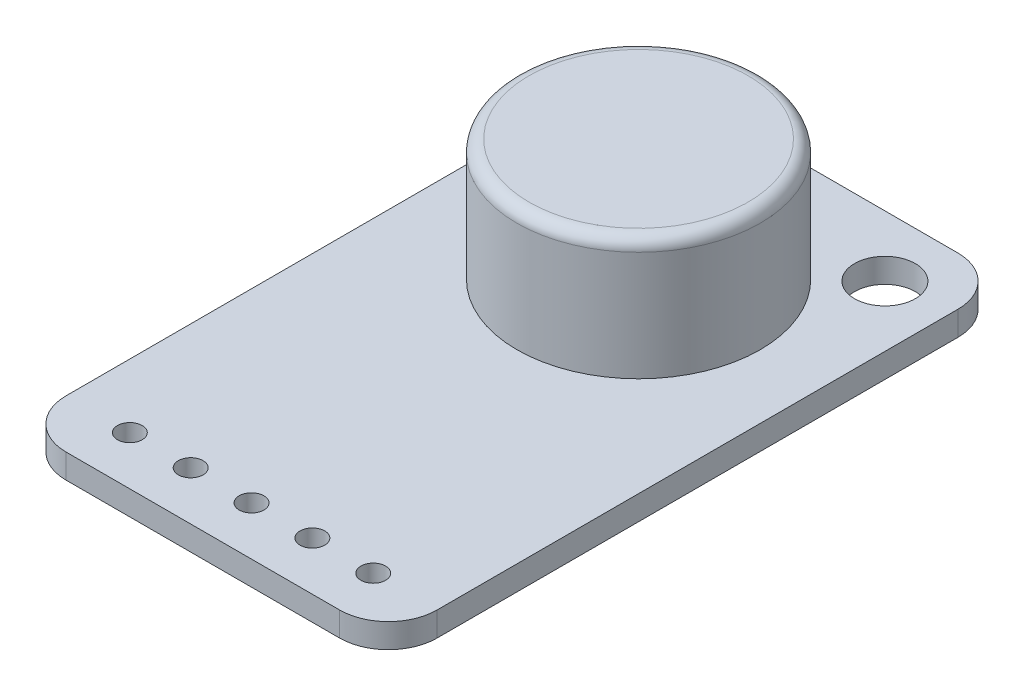
ISO-10303-21;
HEADER;
FILE_DESCRIPTION(('STEP AP214'),'2;1');
FILE_NAME('part.step','',(''),(''),'','','');
FILE_SCHEMA(('AUTOMOTIVE_DESIGN { 1 0 10303 214 1 1 1 1 }'));
ENDSEC;
DATA;
#1=APPLICATION_CONTEXT('core data for automotive mechanical design processes');
#2=APPLICATION_PROTOCOL_DEFINITION('international standard','automotive_design',2000,#1);
#3=PRODUCT_CONTEXT('',#1,'mechanical');
#4=PRODUCT('Part','Part','',(#3));
#5=PRODUCT_RELATED_PRODUCT_CATEGORY('part','',(#4));
#6=PRODUCT_DEFINITION_FORMATION('','',#4);
#7=PRODUCT_DEFINITION_CONTEXT('part definition',#1,'design');
#8=PRODUCT_DEFINITION('design','',#6,#7);
#9=PRODUCT_DEFINITION_SHAPE('','',#8);
#10=(LENGTH_UNIT() NAMED_UNIT(*) SI_UNIT(.MILLI.,.METRE.));
#11=(NAMED_UNIT(*) PLANE_ANGLE_UNIT() SI_UNIT($,.RADIAN.));
#12=(NAMED_UNIT(*) SI_UNIT($,.STERADIAN.) SOLID_ANGLE_UNIT());
#13=UNCERTAINTY_MEASURE_WITH_UNIT(LENGTH_MEASURE(1.E-05),#10,'distance_accuracy_value','');
#14=(GEOMETRIC_REPRESENTATION_CONTEXT(3) GLOBAL_UNCERTAINTY_ASSIGNED_CONTEXT((#13)) GLOBAL_UNIT_ASSIGNED_CONTEXT((#10,
#11,#12)) REPRESENTATION_CONTEXT('',''));
#15=CARTESIAN_POINT('',(0.,0.,0.));
#16=DIRECTION('',(0.,0.,1.));
#17=DIRECTION('',(1.,0.,0.));
#18=AXIS2_PLACEMENT_3D('',#15,#16,#17);
#19=CARTESIAN_POINT('',(0.,1.,0.));
#20=DIRECTION('',(-1.,0.,0.));
#21=DIRECTION('',(0.,0.,1.));
#22=AXIS2_PLACEMENT_3D('',#19,#20,#21);
#23=PLANE('',#22);
#24=DIRECTION('',(0.,0.,-1.));
#25=VECTOR('',#24,1.);
#26=CARTESIAN_POINT('',(0.,1.,0.));
#27=LINE('',#26,#25);
#28=CARTESIAN_POINT('',(0.,1.,-2.));
#29=VERTEX_POINT('',#28);
#30=CARTESIAN_POINT('',(0.,1.,-23.4));
#31=VERTEX_POINT('',#30);
#32=EDGE_CURVE('E129',#29,#31,#27,.T.);
#33=ORIENTED_EDGE('',*,*,#32,.F.);
#34=DIRECTION('',(0.,-1.,0.));
#35=VECTOR('',#34,1.);
#36=CARTESIAN_POINT('',(0.,1.,-2.));
#37=LINE('',#36,#35);
#38=CARTESIAN_POINT('',(0.,0.,-2.));
#39=VERTEX_POINT('',#38);
#40=EDGE_CURVE('E155',#29,#39,#37,.T.);
#41=ORIENTED_EDGE('',*,*,#40,.T.);
#42=DIRECTION('',(0.,0.,-1.));
#43=VECTOR('',#42,1.);
#44=CARTESIAN_POINT('',(0.,0.,0.));
#45=LINE('',#44,#43);
#46=CARTESIAN_POINT('',(0.,0.,-23.4));
#47=VERTEX_POINT('',#46);
#48=EDGE_CURVE('E209',#39,#47,#45,.T.);
#49=ORIENTED_EDGE('',*,*,#48,.T.);
#50=DIRECTION('',(0.,-1.,0.));
#51=VECTOR('',#50,1.);
#52=CARTESIAN_POINT('',(0.,1.,-23.4));
#53=LINE('',#52,#51);
#54=EDGE_CURVE('E153',#47,#31,#53,.F.);
#55=ORIENTED_EDGE('',*,*,#54,.T.);
#56=EDGE_LOOP('',(#33,#41,#49,#55));
#57=FACE_BOUND('',#56,.T.);
#58=ADVANCED_FACE('F36',(#57),#23,.F.);
#59=CARTESIAN_POINT('',(0.,1.,-25.4));
#60=DIRECTION('',(0.,0.,1.));
#61=DIRECTION('',(1.,0.,0.));
#62=AXIS2_PLACEMENT_3D('',#59,#60,#61);
#63=PLANE('',#62);
#64=DIRECTION('',(-1.,0.,0.));
#65=VECTOR('',#64,1.);
#66=CARTESIAN_POINT('',(0.,0.,-25.4));
#67=LINE('',#66,#65);
#68=CARTESIAN_POINT('',(-2.,0.,-25.4));
#69=VERTEX_POINT('',#68);
#70=CARTESIAN_POINT('',(-13.24,0.,-25.4));
#71=VERTEX_POINT('',#70);
#72=EDGE_CURVE('E134',#69,#71,#67,.T.);
#73=ORIENTED_EDGE('',*,*,#72,.T.);
#74=DIRECTION('',(0.,-1.,0.));
#75=VECTOR('',#74,1.);
#76=CARTESIAN_POINT('',(-13.24,1.,-25.4));
#77=LINE('',#76,#75);
#78=CARTESIAN_POINT('',(-13.24,1.,-25.4));
#79=VERTEX_POINT('',#78);
#80=EDGE_CURVE('E51',#71,#79,#77,.F.);
#81=ORIENTED_EDGE('',*,*,#80,.T.);
#82=DIRECTION('',(-1.,0.,0.));
#83=VECTOR('',#82,1.);
#84=CARTESIAN_POINT('',(0.,1.,-25.4));
#85=LINE('',#84,#83);
#86=CARTESIAN_POINT('',(-2.,1.,-25.4));
#87=VERTEX_POINT('',#86);
#88=EDGE_CURVE('E132',#87,#79,#85,.T.);
#89=ORIENTED_EDGE('',*,*,#88,.F.);
#90=DIRECTION('',(0.,-1.,0.));
#91=VECTOR('',#90,1.);
#92=CARTESIAN_POINT('',(-2.,1.,-25.4));
#93=LINE('',#92,#91);
#94=EDGE_CURVE('E158',#87,#69,#93,.T.);
#95=ORIENTED_EDGE('',*,*,#94,.T.);
#96=EDGE_LOOP('',(#73,#81,#89,#95));
#97=FACE_BOUND('',#96,.T.);
#98=ADVANCED_FACE('F175',(#97),#63,.F.);
#99=CARTESIAN_POINT('',(-15.24,1.,0.));
#100=DIRECTION('',(1.,0.,0.));
#101=DIRECTION('',(0.,0.,-1.));
#102=AXIS2_PLACEMENT_3D('',#99,#100,#101);
#103=PLANE('',#102);
#104=DIRECTION('',(0.,0.,1.));
#105=VECTOR('',#104,1.);
#106=CARTESIAN_POINT('',(-15.24,0.,0.));
#107=LINE('',#106,#105);
#108=CARTESIAN_POINT('',(-15.24,0.,-23.4));
#109=VERTEX_POINT('',#108);
#110=CARTESIAN_POINT('',(-15.24,0.,-2.));
#111=VERTEX_POINT('',#110);
#112=EDGE_CURVE('E130',#109,#111,#107,.T.);
#113=ORIENTED_EDGE('',*,*,#112,.T.);
#114=DIRECTION('',(0.,-1.,0.));
#115=VECTOR('',#114,1.);
#116=CARTESIAN_POINT('',(-15.24,1.,-2.));
#117=LINE('',#116,#115);
#118=CARTESIAN_POINT('',(-15.24,1.,-2.));
#119=VERTEX_POINT('',#118);
#120=EDGE_CURVE('E108',#111,#119,#117,.F.);
#121=ORIENTED_EDGE('',*,*,#120,.T.);
#122=DIRECTION('',(0.,0.,1.));
#123=VECTOR('',#122,1.);
#124=CARTESIAN_POINT('',(-15.24,1.,0.));
#125=LINE('',#124,#123);
#126=CARTESIAN_POINT('',(-15.24,1.,-23.4));
#127=VERTEX_POINT('',#126);
#128=EDGE_CURVE('E214',#127,#119,#125,.T.);
#129=ORIENTED_EDGE('',*,*,#128,.F.);
#130=DIRECTION('',(0.,-1.,0.));
#131=VECTOR('',#130,1.);
#132=CARTESIAN_POINT('',(-15.24,1.,-23.4));
#133=LINE('',#132,#131);
#134=EDGE_CURVE('E113',#127,#109,#133,.T.);
#135=ORIENTED_EDGE('',*,*,#134,.T.);
#136=EDGE_LOOP('',(#113,#121,#129,#135));
#137=FACE_BOUND('',#136,.T.);
#138=ADVANCED_FACE('F181',(#137),#103,.F.);
#139=CARTESIAN_POINT('',(0.,1.,0.));
#140=DIRECTION('',(0.,0.,-1.));
#141=DIRECTION('',(-1.,0.,0.));
#142=AXIS2_PLACEMENT_3D('',#139,#140,#141);
#143=PLANE('',#142);
#144=DIRECTION('',(1.,0.,0.));
#145=VECTOR('',#144,1.);
#146=CARTESIAN_POINT('',(0.,1.,0.));
#147=LINE('',#146,#145);
#148=CARTESIAN_POINT('',(-13.24,1.,0.));
#149=VERTEX_POINT('',#148);
#150=CARTESIAN_POINT('',(-2.,1.,0.));
#151=VERTEX_POINT('',#150);
#152=EDGE_CURVE('E123',#149,#151,#147,.T.);
#153=ORIENTED_EDGE('',*,*,#152,.F.);
#154=DIRECTION('',(0.,-1.,0.));
#155=VECTOR('',#154,1.);
#156=CARTESIAN_POINT('',(-13.24,1.,0.));
#157=LINE('',#156,#155);
#158=CARTESIAN_POINT('',(-13.24,0.,0.));
#159=VERTEX_POINT('',#158);
#160=EDGE_CURVE('E107',#149,#159,#157,.T.);
#161=ORIENTED_EDGE('',*,*,#160,.T.);
#162=DIRECTION('',(1.,0.,0.));
#163=VECTOR('',#162,1.);
#164=CARTESIAN_POINT('',(0.,0.,0.));
#165=LINE('',#164,#163);
#166=CARTESIAN_POINT('',(-2.,0.,0.));
#167=VERTEX_POINT('',#166);
#168=EDGE_CURVE('E120',#159,#167,#165,.T.);
#169=ORIENTED_EDGE('',*,*,#168,.T.);
#170=DIRECTION('',(0.,-1.,0.));
#171=VECTOR('',#170,1.);
#172=CARTESIAN_POINT('',(-2.,1.,0.));
#173=LINE('',#172,#171);
#174=EDGE_CURVE('E125',#167,#151,#173,.F.);
#175=ORIENTED_EDGE('',*,*,#174,.T.);
#176=EDGE_LOOP('',(#153,#161,#169,#175));
#177=FACE_BOUND('',#176,.T.);
#178=ADVANCED_FACE('F119',(#177),#143,.F.);
#179=CARTESIAN_POINT('',(0.,1.,0.));
#180=DIRECTION('',(0.,1.,0.));
#181=DIRECTION('',(0.,0.,1.));
#182=AXIS2_PLACEMENT_3D('',#179,#180,#181);
#183=PLANE('',#182);
#184=CARTESIAN_POINT('',(-7.62,1.,-17.9));
#185=DIRECTION('',(0.,1.,0.));
#186=DIRECTION('',(0.,0.,1.));
#187=AXIS2_PLACEMENT_3D('',#184,#185,#186);
#188=CIRCLE('',#187,5.);
#189=CARTESIAN_POINT('',(-7.62,1.,-12.9));
#190=VERTEX_POINT('',#189);
#191=EDGE_CURVE('E228',#190,#190,#188,.T.);
#192=ORIENTED_EDGE('',*,*,#191,.F.);
#193=EDGE_LOOP('',(#192));
#194=FACE_BOUND('',#193,.T.);
#195=CARTESIAN_POINT('',(-12.74,1.,-22.9));
#196=DIRECTION('',(0.,1.,0.));
#197=DIRECTION('',(0.,0.,1.));
#198=AXIS2_PLACEMENT_3D('',#195,#196,#197);
#199=CIRCLE('',#198,1.25);
#200=CARTESIAN_POINT('',(-12.74,1.,-21.65));
#201=VERTEX_POINT('',#200);
#202=EDGE_CURVE('E255',#201,#201,#199,.T.);
#203=ORIENTED_EDGE('',*,*,#202,.F.);
#204=EDGE_LOOP('',(#203));
#205=FACE_BOUND('',#204,.T.);
#206=CARTESIAN_POINT('',(-12.62,1.,-2.));
#207=DIRECTION('',(0.,1.,0.));
#208=DIRECTION('',(0.,0.,1.));
#209=AXIS2_PLACEMENT_3D('',#206,#207,#208);
#210=CIRCLE('',#209,0.508);
#211=CARTESIAN_POINT('',(-12.62,1.,-1.492));
#212=VERTEX_POINT('',#211);
#213=EDGE_CURVE('E249',#212,#212,#210,.T.);
#214=ORIENTED_EDGE('',*,*,#213,.F.);
#215=EDGE_LOOP('',(#214));
#216=FACE_BOUND('',#215,.T.);
#217=CARTESIAN_POINT('',(-10.12,1.,-2.));
#218=DIRECTION('',(0.,1.,0.));
#219=DIRECTION('',(0.,0.,1.));
#220=AXIS2_PLACEMENT_3D('',#217,#218,#219);
#221=CIRCLE('',#220,0.508);
#222=CARTESIAN_POINT('',(-10.12,1.,-1.492));
#223=VERTEX_POINT('',#222);
#224=EDGE_CURVE('E243',#223,#223,#221,.T.);
#225=ORIENTED_EDGE('',*,*,#224,.F.);
#226=EDGE_LOOP('',(#225));
#227=FACE_BOUND('',#226,.T.);
#228=CARTESIAN_POINT('',(-7.62,1.,-2.));
#229=DIRECTION('',(0.,1.,0.));
#230=DIRECTION('',(0.,0.,1.));
#231=AXIS2_PLACEMENT_3D('',#228,#229,#230);
#232=CIRCLE('',#231,0.508);
#233=CARTESIAN_POINT('',(-7.62,1.,-1.492));
#234=VERTEX_POINT('',#233);
#235=EDGE_CURVE('E237',#234,#234,#232,.T.);
#236=ORIENTED_EDGE('',*,*,#235,.F.);
#237=EDGE_LOOP('',(#236));
#238=FACE_BOUND('',#237,.T.);
#239=CARTESIAN_POINT('',(-5.12,1.,-2.));
#240=DIRECTION('',(0.,1.,0.));
#241=DIRECTION('',(0.,0.,1.));
#242=AXIS2_PLACEMENT_3D('',#239,#240,#241);
#243=CIRCLE('',#242,0.508);
#244=CARTESIAN_POINT('',(-5.12,1.,-1.492));
#245=VERTEX_POINT('',#244);
#246=EDGE_CURVE('E231',#245,#245,#243,.T.);
#247=ORIENTED_EDGE('',*,*,#246,.F.);
#248=EDGE_LOOP('',(#247));
#249=FACE_BOUND('',#248,.T.);
#250=CARTESIAN_POINT('',(-2.62,1.,-2.));
#251=DIRECTION('',(0.,1.,0.));
#252=DIRECTION('',(0.,0.,1.));
#253=AXIS2_PLACEMENT_3D('',#250,#251,#252);
#254=CIRCLE('',#253,0.508);
#255=CARTESIAN_POINT('',(-2.62,1.,-1.492));
#256=VERTEX_POINT('',#255);
#257=EDGE_CURVE('E224',#256,#256,#254,.T.);
#258=ORIENTED_EDGE('',*,*,#257,.F.);
#259=EDGE_LOOP('',(#258));
#260=FACE_BOUND('',#259,.T.);
#261=CARTESIAN_POINT('',(-2.5,1.,-22.9));
#262=DIRECTION('',(0.,1.,0.));
#263=DIRECTION('',(0.,0.,1.));
#264=AXIS2_PLACEMENT_3D('',#261,#262,#263);
#265=CIRCLE('',#264,1.25);
#266=CARTESIAN_POINT('',(-2.5,1.,-21.65));
#267=VERTEX_POINT('',#266);
#268=EDGE_CURVE('E218',#267,#267,#265,.T.);
#269=ORIENTED_EDGE('',*,*,#268,.F.);
#270=EDGE_LOOP('',(#269));
#271=FACE_BOUND('',#270,.T.);
#272=ORIENTED_EDGE('',*,*,#128,.T.);
#273=CARTESIAN_POINT('',(-13.24,1.,-2.));
#274=DIRECTION('',(0.,1.,0.));
#275=DIRECTION('',(0.,0.,1.));
#276=AXIS2_PLACEMENT_3D('',#273,#274,#275);
#277=CIRCLE('',#276,2.);
#278=EDGE_CURVE('E151',#119,#149,#277,.T.);
#279=ORIENTED_EDGE('',*,*,#278,.T.);
#280=ORIENTED_EDGE('',*,*,#152,.T.);
#281=CARTESIAN_POINT('',(-2.,1.,-2.));
#282=DIRECTION('',(0.,1.,0.));
#283=DIRECTION('',(0.,0.,1.));
#284=AXIS2_PLACEMENT_3D('',#281,#282,#283);
#285=CIRCLE('',#284,2.);
#286=EDGE_CURVE('E149',#151,#29,#285,.T.);
#287=ORIENTED_EDGE('',*,*,#286,.T.);
#288=ORIENTED_EDGE('',*,*,#32,.T.);
#289=CARTESIAN_POINT('',(-2.,1.,-23.4));
#290=DIRECTION('',(0.,1.,0.));
#291=DIRECTION('',(0.,0.,1.));
#292=AXIS2_PLACEMENT_3D('',#289,#290,#291);
#293=CIRCLE('',#292,2.);
#294=EDGE_CURVE('E58',#31,#87,#293,.T.);
#295=ORIENTED_EDGE('',*,*,#294,.T.);
#296=ORIENTED_EDGE('',*,*,#88,.T.);
#297=CARTESIAN_POINT('',(-13.24,1.,-23.4));
#298=DIRECTION('',(0.,1.,0.));
#299=DIRECTION('',(0.,0.,1.));
#300=AXIS2_PLACEMENT_3D('',#297,#298,#299);
#301=CIRCLE('',#300,2.);
#302=EDGE_CURVE('E147',#79,#127,#301,.T.);
#303=ORIENTED_EDGE('',*,*,#302,.T.);
#304=EDGE_LOOP('',(#272,#279,#280,#287,#288,#295,#296,#303));
#305=FACE_BOUND('',#304,.T.);
#306=ADVANCED_FACE('F264',(#194,#205,#216,#227,#238,#249,#260,#271,#305),#183,.T.);
#307=CARTESIAN_POINT('',(0.,0.,0.));
#308=DIRECTION('',(0.,1.,0.));
#309=DIRECTION('',(0.,0.,1.));
#310=AXIS2_PLACEMENT_3D('',#307,#308,#309);
#311=PLANE('',#310);
#312=CARTESIAN_POINT('',(-12.74,0.,-22.9));
#313=DIRECTION('',(0.,1.,0.));
#314=DIRECTION('',(0.,0.,1.));
#315=AXIS2_PLACEMENT_3D('',#312,#313,#314);
#316=CIRCLE('',#315,1.25);
#317=CARTESIAN_POINT('',(-12.74,0.,-21.65));
#318=VERTEX_POINT('',#317);
#319=EDGE_CURVE('E221',#318,#318,#316,.T.);
#320=ORIENTED_EDGE('',*,*,#319,.T.);
#321=EDGE_LOOP('',(#320));
#322=FACE_BOUND('',#321,.T.);
#323=CARTESIAN_POINT('',(-12.62,0.,-2.));
#324=DIRECTION('',(0.,1.,0.));
#325=DIRECTION('',(0.,0.,1.));
#326=AXIS2_PLACEMENT_3D('',#323,#324,#325);
#327=CIRCLE('',#326,0.508);
#328=CARTESIAN_POINT('',(-12.62,0.,-1.492));
#329=VERTEX_POINT('',#328);
#330=EDGE_CURVE('E252',#329,#329,#327,.T.);
#331=ORIENTED_EDGE('',*,*,#330,.T.);
#332=EDGE_LOOP('',(#331));
#333=FACE_BOUND('',#332,.T.);
#334=CARTESIAN_POINT('',(-10.12,0.,-2.));
#335=DIRECTION('',(0.,1.,0.));
#336=DIRECTION('',(0.,0.,1.));
#337=AXIS2_PLACEMENT_3D('',#334,#335,#336);
#338=CIRCLE('',#337,0.508);
#339=CARTESIAN_POINT('',(-10.12,0.,-1.492));
#340=VERTEX_POINT('',#339);
#341=EDGE_CURVE('E246',#340,#340,#338,.T.);
#342=ORIENTED_EDGE('',*,*,#341,.T.);
#343=EDGE_LOOP('',(#342));
#344=FACE_BOUND('',#343,.T.);
#345=CARTESIAN_POINT('',(-7.62,0.,-2.));
#346=DIRECTION('',(0.,1.,0.));
#347=DIRECTION('',(0.,0.,1.));
#348=AXIS2_PLACEMENT_3D('',#345,#346,#347);
#349=CIRCLE('',#348,0.508);
#350=CARTESIAN_POINT('',(-7.62,0.,-1.492));
#351=VERTEX_POINT('',#350);
#352=EDGE_CURVE('E240',#351,#351,#349,.T.);
#353=ORIENTED_EDGE('',*,*,#352,.T.);
#354=EDGE_LOOP('',(#353));
#355=FACE_BOUND('',#354,.T.);
#356=CARTESIAN_POINT('',(-5.12,0.,-2.));
#357=DIRECTION('',(0.,1.,0.));
#358=DIRECTION('',(0.,0.,1.));
#359=AXIS2_PLACEMENT_3D('',#356,#357,#358);
#360=CIRCLE('',#359,0.508);
#361=CARTESIAN_POINT('',(-5.12,0.,-1.492));
#362=VERTEX_POINT('',#361);
#363=EDGE_CURVE('E234',#362,#362,#360,.T.);
#364=ORIENTED_EDGE('',*,*,#363,.T.);
#365=EDGE_LOOP('',(#364));
#366=FACE_BOUND('',#365,.T.);
#367=CARTESIAN_POINT('',(-2.62,0.,-2.));
#368=DIRECTION('',(0.,1.,0.));
#369=DIRECTION('',(0.,0.,1.));
#370=AXIS2_PLACEMENT_3D('',#367,#368,#369);
#371=CIRCLE('',#370,0.508);
#372=CARTESIAN_POINT('',(-2.62,0.,-1.492));
#373=VERTEX_POINT('',#372);
#374=EDGE_CURVE('E227',#373,#373,#371,.T.);
#375=ORIENTED_EDGE('',*,*,#374,.T.);
#376=EDGE_LOOP('',(#375));
#377=FACE_BOUND('',#376,.T.);
#378=CARTESIAN_POINT('',(-2.5,0.,-22.9));
#379=DIRECTION('',(0.,1.,0.));
#380=DIRECTION('',(0.,0.,1.));
#381=AXIS2_PLACEMENT_3D('',#378,#379,#380);
#382=CIRCLE('',#381,1.25);
#383=CARTESIAN_POINT('',(-2.5,0.,-21.65));
#384=VERTEX_POINT('',#383);
#385=EDGE_CURVE('E210',#384,#384,#382,.T.);
#386=ORIENTED_EDGE('',*,*,#385,.T.);
#387=EDGE_LOOP('',(#386));
#388=FACE_BOUND('',#387,.T.);
#389=ORIENTED_EDGE('',*,*,#168,.F.);
#390=CARTESIAN_POINT('',(-13.24,0.,-2.));
#391=DIRECTION('',(0.,1.,0.));
#392=DIRECTION('',(0.,0.,1.));
#393=AXIS2_PLACEMENT_3D('',#390,#391,#392);
#394=CIRCLE('',#393,2.);
#395=EDGE_CURVE('E103',#159,#111,#394,.F.);
#396=ORIENTED_EDGE('',*,*,#395,.T.);
#397=ORIENTED_EDGE('',*,*,#112,.F.);
#398=CARTESIAN_POINT('',(-13.24,0.,-23.4));
#399=DIRECTION('',(0.,1.,0.));
#400=DIRECTION('',(0.,0.,1.));
#401=AXIS2_PLACEMENT_3D('',#398,#399,#400);
#402=CIRCLE('',#401,2.);
#403=EDGE_CURVE('E140',#109,#71,#402,.F.);
#404=ORIENTED_EDGE('',*,*,#403,.T.);
#405=ORIENTED_EDGE('',*,*,#72,.F.);
#406=CARTESIAN_POINT('',(-2.,0.,-23.4));
#407=DIRECTION('',(0.,1.,0.));
#408=DIRECTION('',(0.,0.,1.));
#409=AXIS2_PLACEMENT_3D('',#406,#407,#408);
#410=CIRCLE('',#409,2.);
#411=EDGE_CURVE('E124',#69,#47,#410,.F.);
#412=ORIENTED_EDGE('',*,*,#411,.T.);
#413=ORIENTED_EDGE('',*,*,#48,.F.);
#414=CARTESIAN_POINT('',(-2.,0.,-2.));
#415=DIRECTION('',(0.,1.,0.));
#416=DIRECTION('',(0.,0.,1.));
#417=AXIS2_PLACEMENT_3D('',#414,#415,#416);
#418=CIRCLE('',#417,2.);
#419=EDGE_CURVE('E114',#39,#167,#418,.F.);
#420=ORIENTED_EDGE('',*,*,#419,.T.);
#421=EDGE_LOOP('',(#389,#396,#397,#404,#405,#412,#413,#420));
#422=FACE_BOUND('',#421,.T.);
#423=ADVANCED_FACE('F127',(#322,#333,#344,#355,#366,#377,#388,#422),#311,.F.);
#424=CARTESIAN_POINT('',(-13.24,1.,-2.));
#425=DIRECTION('',(0.,-1.,0.));
#426=DIRECTION('',(0.,0.,-1.));
#427=AXIS2_PLACEMENT_3D('',#424,#425,#426);
#428=CYLINDRICAL_SURFACE('',#427,2.);
#429=ORIENTED_EDGE('',*,*,#278,.F.);
#430=ORIENTED_EDGE('',*,*,#120,.F.);
#431=ORIENTED_EDGE('',*,*,#395,.F.);
#432=ORIENTED_EDGE('',*,*,#160,.F.);
#433=EDGE_LOOP('',(#429,#430,#431,#432));
#434=FACE_BOUND('',#433,.T.);
#435=ADVANCED_FACE('F106',(#434),#428,.T.);
#436=CARTESIAN_POINT('',(-2.,1.,-2.));
#437=DIRECTION('',(0.,-1.,0.));
#438=DIRECTION('',(0.,0.,-1.));
#439=AXIS2_PLACEMENT_3D('',#436,#437,#438);
#440=CYLINDRICAL_SURFACE('',#439,2.);
#441=ORIENTED_EDGE('',*,*,#286,.F.);
#442=ORIENTED_EDGE('',*,*,#174,.F.);
#443=ORIENTED_EDGE('',*,*,#419,.F.);
#444=ORIENTED_EDGE('',*,*,#40,.F.);
#445=EDGE_LOOP('',(#441,#442,#443,#444));
#446=FACE_BOUND('',#445,.T.);
#447=ADVANCED_FACE('F188',(#446),#440,.T.);
#448=CARTESIAN_POINT('',(-13.24,1.,-23.4));
#449=DIRECTION('',(0.,-1.,0.));
#450=DIRECTION('',(0.,0.,-1.));
#451=AXIS2_PLACEMENT_3D('',#448,#449,#450);
#452=CYLINDRICAL_SURFACE('',#451,2.);
#453=ORIENTED_EDGE('',*,*,#302,.F.);
#454=ORIENTED_EDGE('',*,*,#80,.F.);
#455=ORIENTED_EDGE('',*,*,#403,.F.);
#456=ORIENTED_EDGE('',*,*,#134,.F.);
#457=EDGE_LOOP('',(#453,#454,#455,#456));
#458=FACE_BOUND('',#457,.T.);
#459=ADVANCED_FACE('F191',(#458),#452,.T.);
#460=CARTESIAN_POINT('',(-2.,1.,-23.4));
#461=DIRECTION('',(0.,-1.,0.));
#462=DIRECTION('',(0.,0.,-1.));
#463=AXIS2_PLACEMENT_3D('',#460,#461,#462);
#464=CYLINDRICAL_SURFACE('',#463,2.);
#465=ORIENTED_EDGE('',*,*,#294,.F.);
#466=ORIENTED_EDGE('',*,*,#54,.F.);
#467=ORIENTED_EDGE('',*,*,#411,.F.);
#468=ORIENTED_EDGE('',*,*,#94,.F.);
#469=EDGE_LOOP('',(#465,#466,#467,#468));
#470=FACE_BOUND('',#469,.T.);
#471=ADVANCED_FACE('F194',(#470),#464,.T.);
#472=CARTESIAN_POINT('',(-2.5,0.,-22.9));
#473=DIRECTION('',(0.,1.,0.));
#474=DIRECTION('',(0.,0.,1.));
#475=AXIS2_PLACEMENT_3D('',#472,#473,#474);
#476=CYLINDRICAL_SURFACE('',#475,1.25);
#477=ORIENTED_EDGE('',*,*,#385,.F.);
#478=EDGE_LOOP('',(#477));
#479=FACE_BOUND('',#478,.T.);
#480=ORIENTED_EDGE('',*,*,#268,.T.);
#481=EDGE_LOOP('',(#480));
#482=FACE_BOUND('',#481,.T.);
#483=ADVANCED_FACE('F197',(#479,#482),#476,.F.);
#484=CARTESIAN_POINT('',(-2.62,0.,-2.));
#485=DIRECTION('',(0.,1.,0.));
#486=DIRECTION('',(0.,0.,1.));
#487=AXIS2_PLACEMENT_3D('',#484,#485,#486);
#488=CYLINDRICAL_SURFACE('',#487,0.508);
#489=ORIENTED_EDGE('',*,*,#374,.F.);
#490=EDGE_LOOP('',(#489));
#491=FACE_BOUND('',#490,.T.);
#492=ORIENTED_EDGE('',*,*,#257,.T.);
#493=EDGE_LOOP('',(#492));
#494=FACE_BOUND('',#493,.T.);
#495=ADVANCED_FACE('F202',(#491,#494),#488,.F.);
#496=CARTESIAN_POINT('',(-5.12,0.,-2.));
#497=DIRECTION('',(0.,1.,0.));
#498=DIRECTION('',(0.,0.,1.));
#499=AXIS2_PLACEMENT_3D('',#496,#497,#498);
#500=CYLINDRICAL_SURFACE('',#499,0.508);
#501=ORIENTED_EDGE('',*,*,#363,.F.);
#502=EDGE_LOOP('',(#501));
#503=FACE_BOUND('',#502,.T.);
#504=ORIENTED_EDGE('',*,*,#246,.T.);
#505=EDGE_LOOP('',(#504));
#506=FACE_BOUND('',#505,.T.);
#507=ADVANCED_FACE('F296',(#503,#506),#500,.F.);
#508=CARTESIAN_POINT('',(-7.62,0.,-2.));
#509=DIRECTION('',(0.,1.,0.));
#510=DIRECTION('',(0.,0.,1.));
#511=AXIS2_PLACEMENT_3D('',#508,#509,#510);
#512=CYLINDRICAL_SURFACE('',#511,0.508);
#513=ORIENTED_EDGE('',*,*,#352,.F.);
#514=EDGE_LOOP('',(#513));
#515=FACE_BOUND('',#514,.T.);
#516=ORIENTED_EDGE('',*,*,#235,.T.);
#517=EDGE_LOOP('',(#516));
#518=FACE_BOUND('',#517,.T.);
#519=ADVANCED_FACE('F300',(#515,#518),#512,.F.);
#520=CARTESIAN_POINT('',(-10.12,0.,-2.));
#521=DIRECTION('',(0.,1.,0.));
#522=DIRECTION('',(0.,0.,1.));
#523=AXIS2_PLACEMENT_3D('',#520,#521,#522);
#524=CYLINDRICAL_SURFACE('',#523,0.508);
#525=ORIENTED_EDGE('',*,*,#341,.F.);
#526=EDGE_LOOP('',(#525));
#527=FACE_BOUND('',#526,.T.);
#528=ORIENTED_EDGE('',*,*,#224,.T.);
#529=EDGE_LOOP('',(#528));
#530=FACE_BOUND('',#529,.T.);
#531=ADVANCED_FACE('F304',(#527,#530),#524,.F.);
#532=CARTESIAN_POINT('',(-12.62,0.,-2.));
#533=DIRECTION('',(0.,1.,0.));
#534=DIRECTION('',(0.,0.,1.));
#535=AXIS2_PLACEMENT_3D('',#532,#533,#534);
#536=CYLINDRICAL_SURFACE('',#535,0.508);
#537=ORIENTED_EDGE('',*,*,#330,.F.);
#538=EDGE_LOOP('',(#537));
#539=FACE_BOUND('',#538,.T.);
#540=ORIENTED_EDGE('',*,*,#213,.T.);
#541=EDGE_LOOP('',(#540));
#542=FACE_BOUND('',#541,.T.);
#543=ADVANCED_FACE('F308',(#539,#542),#536,.F.);
#544=CARTESIAN_POINT('',(-12.74,0.,-22.9));
#545=DIRECTION('',(0.,1.,0.));
#546=DIRECTION('',(0.,0.,1.));
#547=AXIS2_PLACEMENT_3D('',#544,#545,#546);
#548=CYLINDRICAL_SURFACE('',#547,1.25);
#549=ORIENTED_EDGE('',*,*,#319,.F.);
#550=EDGE_LOOP('',(#549));
#551=FACE_BOUND('',#550,.T.);
#552=ORIENTED_EDGE('',*,*,#202,.T.);
#553=EDGE_LOOP('',(#552));
#554=FACE_BOUND('',#553,.T.);
#555=ADVANCED_FACE('F312',(#551,#554),#548,.F.);
#556=CARTESIAN_POINT('',(-7.62,6.,-17.9));
#557=DIRECTION('',(0.,-1.,0.));
#558=DIRECTION('',(0.,0.,-1.));
#559=AXIS2_PLACEMENT_3D('',#556,#557,#558);
#560=CYLINDRICAL_SURFACE('',#559,5.);
#561=CARTESIAN_POINT('',(-7.62,5.5,-17.9));
#562=DIRECTION('',(0.,1.,0.));
#563=DIRECTION('',(0.,0.,1.));
#564=AXIS2_PLACEMENT_3D('',#561,#562,#563);
#565=CIRCLE('',#564,5.);
#566=CARTESIAN_POINT('',(-7.62,5.5,-12.9));
#567=VERTEX_POINT('',#566);
#568=EDGE_CURVE('E11',#567,#567,#565,.F.);
#569=ORIENTED_EDGE('',*,*,#568,.T.);
#570=EDGE_LOOP('',(#569));
#571=FACE_BOUND('',#570,.T.);
#572=ORIENTED_EDGE('',*,*,#191,.T.);
#573=EDGE_LOOP('',(#572));
#574=FACE_BOUND('',#573,.T.);
#575=ADVANCED_FACE('F171',(#571,#574),#560,.T.);
#576=CARTESIAN_POINT('',(-7.62,6.,-17.9));
#577=DIRECTION('',(0.,1.,0.));
#578=DIRECTION('',(0.,0.,1.));
#579=AXIS2_PLACEMENT_3D('',#576,#577,#578);
#580=PLANE('',#579);
#581=CARTESIAN_POINT('',(-7.62,6.,-17.9));
#582=DIRECTION('',(0.,1.,0.));
#583=DIRECTION('',(0.,0.,1.));
#584=AXIS2_PLACEMENT_3D('',#581,#582,#583);
#585=CIRCLE('',#584,4.5);
#586=CARTESIAN_POINT('',(-7.62,6.,-13.4));
#587=VERTEX_POINT('',#586);
#588=EDGE_CURVE('E44',#587,#587,#585,.T.);
#589=ORIENTED_EDGE('',*,*,#588,.T.);
#590=EDGE_LOOP('',(#589));
#591=FACE_BOUND('',#590,.T.);
#592=ADVANCED_FACE('F164',(#591),#580,.T.);
#593=CARTESIAN_POINT('',(-7.62,5.5,-17.9));
#594=DIRECTION('',(0.,1.,0.));
#595=DIRECTION('',(0.,0.,1.));
#596=AXIS2_PLACEMENT_3D('',#593,#594,#595);
#597=TOROIDAL_SURFACE('',#596,4.5,0.5);
#598=ORIENTED_EDGE('',*,*,#568,.F.);
#599=EDGE_LOOP('',(#598));
#600=FACE_BOUND('',#599,.T.);
#601=ORIENTED_EDGE('',*,*,#588,.F.);
#602=EDGE_LOOP('',(#601));
#603=FACE_BOUND('',#602,.T.);
#604=ADVANCED_FACE('F38',(#600,#603),#597,.T.);
#605=CLOSED_SHELL('',(#58,#98,#138,#178,#306,#423,#435,#447,#459,#471,#483,#495,#507,#519,#531,
#543,#555,#575,#592,#604));
#606=MANIFOLD_SOLID_BREP('B2',#605);
#607=ADVANCED_BREP_SHAPE_REPRESENTATION('',(#18,#606),#14);
#608=SHAPE_DEFINITION_REPRESENTATION(#9,#607);
ENDSEC;
END-ISO-10303-21;
